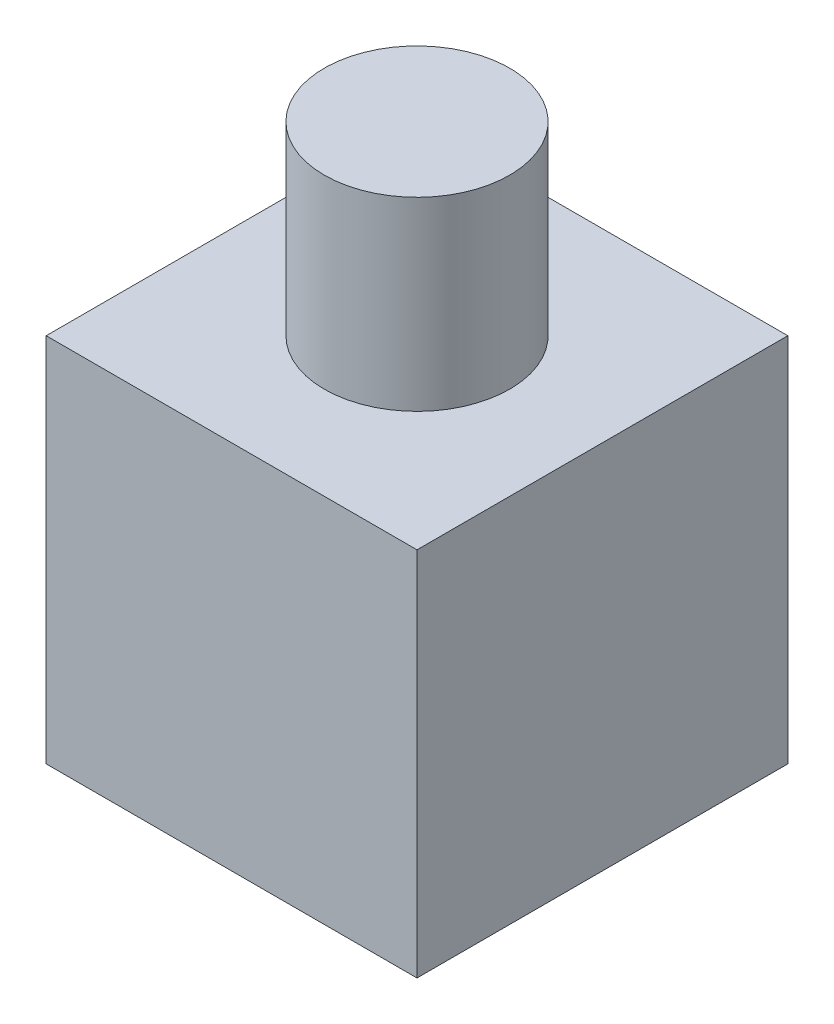
ISO-10303-21;
HEADER;
FILE_DESCRIPTION(('STEP AP214'),'2;1');
FILE_NAME('part.step','',(''),(''),'','','');
FILE_SCHEMA(('AUTOMOTIVE_DESIGN { 1 0 10303 214 1 1 1 1 }'));
ENDSEC;
DATA;
#1=APPLICATION_CONTEXT('core data for automotive mechanical design processes');
#2=APPLICATION_PROTOCOL_DEFINITION('international standard','automotive_design',2000,#1);
#3=PRODUCT_CONTEXT('',#1,'mechanical');
#4=PRODUCT('Part','Part','',(#3));
#5=PRODUCT_RELATED_PRODUCT_CATEGORY('part','',(#4));
#6=PRODUCT_DEFINITION_FORMATION('','',#4);
#7=PRODUCT_DEFINITION_CONTEXT('part definition',#1,'design');
#8=PRODUCT_DEFINITION('design','',#6,#7);
#9=PRODUCT_DEFINITION_SHAPE('','',#8);
#10=(LENGTH_UNIT() NAMED_UNIT(*) SI_UNIT(.MILLI.,.METRE.));
#11=(NAMED_UNIT(*) PLANE_ANGLE_UNIT() SI_UNIT($,.RADIAN.));
#12=(NAMED_UNIT(*) SI_UNIT($,.STERADIAN.) SOLID_ANGLE_UNIT());
#13=UNCERTAINTY_MEASURE_WITH_UNIT(LENGTH_MEASURE(1.E-05),#10,'distance_accuracy_value','');
#14=(GEOMETRIC_REPRESENTATION_CONTEXT(3) GLOBAL_UNCERTAINTY_ASSIGNED_CONTEXT((#13)) GLOBAL_UNIT_ASSIGNED_CONTEXT((#10,
#11,#12)) REPRESENTATION_CONTEXT('',''));
#15=CARTESIAN_POINT('',(0.,0.,0.));
#16=DIRECTION('',(0.,0.,1.));
#17=DIRECTION('',(1.,0.,0.));
#18=AXIS2_PLACEMENT_3D('',#15,#16,#17);
#19=CARTESIAN_POINT('',(0.,254.,0.));
#20=DIRECTION('',(1.,0.,0.));
#21=DIRECTION('',(0.,0.,-1.));
#22=AXIS2_PLACEMENT_3D('',#19,#20,#21);
#23=PLANE('',#22);
#24=DIRECTION('',(0.,0.,1.));
#25=VECTOR('',#24,1.);
#26=CARTESIAN_POINT('',(0.,0.,0.));
#27=LINE('',#26,#25);
#28=CARTESIAN_POINT('',(0.,0.,-254.));
#29=VERTEX_POINT('',#28);
#30=CARTESIAN_POINT('',(0.,0.,0.));
#31=VERTEX_POINT('',#30);
#32=EDGE_CURVE('E110',#29,#31,#27,.T.);
#33=ORIENTED_EDGE('',*,*,#32,.T.);
#34=DIRECTION('',(0.,-1.,0.));
#35=VECTOR('',#34,1.);
#36=CARTESIAN_POINT('',(0.,254.,0.));
#37=LINE('',#36,#35);
#38=CARTESIAN_POINT('',(0.,254.,0.));
#39=VERTEX_POINT('',#38);
#40=EDGE_CURVE('E42',#39,#31,#37,.T.);
#41=ORIENTED_EDGE('',*,*,#40,.F.);
#42=DIRECTION('',(0.,0.,1.));
#43=VECTOR('',#42,1.);
#44=CARTESIAN_POINT('',(0.,254.,0.));
#45=LINE('',#44,#43);
#46=CARTESIAN_POINT('',(0.,254.,-254.));
#47=VERTEX_POINT('',#46);
#48=EDGE_CURVE('E93',#47,#39,#45,.T.);
#49=ORIENTED_EDGE('',*,*,#48,.F.);
#50=DIRECTION('',(0.,-1.,0.));
#51=VECTOR('',#50,1.);
#52=CARTESIAN_POINT('',(0.,254.,-254.));
#53=LINE('',#52,#51);
#54=EDGE_CURVE('E106',#47,#29,#53,.T.);
#55=ORIENTED_EDGE('',*,*,#54,.T.);
#56=EDGE_LOOP('',(#33,#41,#49,#55));
#57=FACE_BOUND('',#56,.T.);
#58=ADVANCED_FACE('F39',(#57),#23,.F.);
#59=CARTESIAN_POINT('',(0.,254.,0.));
#60=DIRECTION('',(0.,0.,-1.));
#61=DIRECTION('',(-1.,0.,0.));
#62=AXIS2_PLACEMENT_3D('',#59,#60,#61);
#63=PLANE('',#62);
#64=DIRECTION('',(1.,0.,0.));
#65=VECTOR('',#64,1.);
#66=CARTESIAN_POINT('',(0.,0.,0.));
#67=LINE('',#66,#65);
#68=CARTESIAN_POINT('',(254.,0.,0.));
#69=VERTEX_POINT('',#68);
#70=EDGE_CURVE('E99',#31,#69,#67,.T.);
#71=ORIENTED_EDGE('',*,*,#70,.T.);
#72=DIRECTION('',(0.,-1.,0.));
#73=VECTOR('',#72,1.);
#74=CARTESIAN_POINT('',(254.,254.,0.));
#75=LINE('',#74,#73);
#76=CARTESIAN_POINT('',(254.,254.,0.));
#77=VERTEX_POINT('',#76);
#78=EDGE_CURVE('E97',#77,#69,#75,.T.);
#79=ORIENTED_EDGE('',*,*,#78,.F.);
#80=DIRECTION('',(1.,0.,0.));
#81=VECTOR('',#80,1.);
#82=CARTESIAN_POINT('',(0.,254.,0.));
#83=LINE('',#82,#81);
#84=EDGE_CURVE('E88',#39,#77,#83,.T.);
#85=ORIENTED_EDGE('',*,*,#84,.F.);
#86=ORIENTED_EDGE('',*,*,#40,.T.);
#87=EDGE_LOOP('',(#71,#79,#85,#86));
#88=FACE_BOUND('',#87,.T.);
#89=ADVANCED_FACE('F98',(#88),#63,.F.);
#90=CARTESIAN_POINT('',(254.,254.,0.));
#91=DIRECTION('',(-1.,0.,0.));
#92=DIRECTION('',(0.,0.,1.));
#93=AXIS2_PLACEMENT_3D('',#90,#91,#92);
#94=PLANE('',#93);
#95=DIRECTION('',(0.,0.,-1.));
#96=VECTOR('',#95,1.);
#97=CARTESIAN_POINT('',(254.,0.,0.));
#98=LINE('',#97,#96);
#99=CARTESIAN_POINT('',(254.,0.,-254.));
#100=VERTEX_POINT('',#99);
#101=EDGE_CURVE('E74',#69,#100,#98,.T.);
#102=ORIENTED_EDGE('',*,*,#101,.T.);
#103=DIRECTION('',(0.,-1.,0.));
#104=VECTOR('',#103,1.);
#105=CARTESIAN_POINT('',(254.,254.,-254.));
#106=LINE('',#105,#104);
#107=CARTESIAN_POINT('',(254.,254.,-254.));
#108=VERTEX_POINT('',#107);
#109=EDGE_CURVE('E101',#108,#100,#106,.T.);
#110=ORIENTED_EDGE('',*,*,#109,.F.);
#111=DIRECTION('',(0.,0.,-1.));
#112=VECTOR('',#111,1.);
#113=CARTESIAN_POINT('',(254.,254.,0.));
#114=LINE('',#113,#112);
#115=EDGE_CURVE('E91',#77,#108,#114,.T.);
#116=ORIENTED_EDGE('',*,*,#115,.F.);
#117=ORIENTED_EDGE('',*,*,#78,.T.);
#118=EDGE_LOOP('',(#102,#110,#116,#117));
#119=FACE_BOUND('',#118,.T.);
#120=ADVANCED_FACE('F102',(#119),#94,.F.);
#121=CARTESIAN_POINT('',(0.,254.,-254.));
#122=DIRECTION('',(0.,0.,1.));
#123=DIRECTION('',(1.,0.,0.));
#124=AXIS2_PLACEMENT_3D('',#121,#122,#123);
#125=PLANE('',#124);
#126=DIRECTION('',(-1.,0.,0.));
#127=VECTOR('',#126,1.);
#128=CARTESIAN_POINT('',(0.,0.,-254.));
#129=LINE('',#128,#127);
#130=EDGE_CURVE('E80',#100,#29,#129,.T.);
#131=ORIENTED_EDGE('',*,*,#130,.T.);
#132=ORIENTED_EDGE('',*,*,#54,.F.);
#133=DIRECTION('',(-1.,0.,0.));
#134=VECTOR('',#133,1.);
#135=CARTESIAN_POINT('',(0.,254.,-254.));
#136=LINE('',#135,#134);
#137=EDGE_CURVE('E57',#108,#47,#136,.T.);
#138=ORIENTED_EDGE('',*,*,#137,.F.);
#139=ORIENTED_EDGE('',*,*,#109,.T.);
#140=EDGE_LOOP('',(#131,#132,#138,#139));
#141=FACE_BOUND('',#140,.T.);
#142=ADVANCED_FACE('F124',(#141),#125,.F.);
#143=CARTESIAN_POINT('',(0.,254.,0.));
#144=DIRECTION('',(0.,-1.,0.));
#145=DIRECTION('',(0.,0.,-1.));
#146=AXIS2_PLACEMENT_3D('',#143,#144,#145);
#147=PLANE('',#146);
#148=CARTESIAN_POINT('',(127.,254.,-127.));
#149=DIRECTION('',(0.,1.,0.));
#150=DIRECTION('',(0.,0.,1.));
#151=AXIS2_PLACEMENT_3D('',#148,#149,#150);
#152=CIRCLE('',#151,63.5);
#153=CARTESIAN_POINT('',(127.,254.,-63.5));
#154=VERTEX_POINT('',#153);
#155=EDGE_CURVE('E11',#154,#154,#152,.T.);
#156=ORIENTED_EDGE('',*,*,#155,.F.);
#157=EDGE_LOOP('',(#156));
#158=FACE_BOUND('',#157,.T.);
#159=ORIENTED_EDGE('',*,*,#48,.T.);
#160=ORIENTED_EDGE('',*,*,#84,.T.);
#161=ORIENTED_EDGE('',*,*,#115,.T.);
#162=ORIENTED_EDGE('',*,*,#137,.T.);
#163=EDGE_LOOP('',(#159,#160,#161,#162));
#164=FACE_BOUND('',#163,.T.);
#165=ADVANCED_FACE('F89',(#158,#164),#147,.F.);
#166=CARTESIAN_POINT('',(0.,0.,0.));
#167=DIRECTION('',(0.,-1.,0.));
#168=DIRECTION('',(0.,0.,-1.));
#169=AXIS2_PLACEMENT_3D('',#166,#167,#168);
#170=PLANE('',#169);
#171=ORIENTED_EDGE('',*,*,#32,.F.);
#172=ORIENTED_EDGE('',*,*,#130,.F.);
#173=ORIENTED_EDGE('',*,*,#101,.F.);
#174=ORIENTED_EDGE('',*,*,#70,.F.);
#175=EDGE_LOOP('',(#171,#172,#173,#174));
#176=FACE_BOUND('',#175,.T.);
#177=ADVANCED_FACE('F127',(#176),#170,.T.);
#178=CARTESIAN_POINT('',(127.,381.,-127.));
#179=DIRECTION('',(0.,-1.,0.));
#180=DIRECTION('',(0.,0.,-1.));
#181=AXIS2_PLACEMENT_3D('',#178,#179,#180);
#182=CYLINDRICAL_SURFACE('',#181,63.5);
#183=CARTESIAN_POINT('',(127.,381.,-127.));
#184=DIRECTION('',(0.,1.,0.));
#185=DIRECTION('',(0.,0.,1.));
#186=AXIS2_PLACEMENT_3D('',#183,#184,#185);
#187=CIRCLE('',#186,63.5);
#188=CARTESIAN_POINT('',(127.,381.,-63.5));
#189=VERTEX_POINT('',#188);
#190=EDGE_CURVE('E114',#189,#189,#187,.T.);
#191=ORIENTED_EDGE('',*,*,#190,.F.);
#192=EDGE_LOOP('',(#191));
#193=FACE_BOUND('',#192,.T.);
#194=ORIENTED_EDGE('',*,*,#155,.T.);
#195=EDGE_LOOP('',(#194));
#196=FACE_BOUND('',#195,.T.);
#197=ADVANCED_FACE('F137',(#193,#196),#182,.T.);
#198=CARTESIAN_POINT('',(127.,381.,-127.));
#199=DIRECTION('',(0.,1.,0.));
#200=DIRECTION('',(0.,0.,1.));
#201=AXIS2_PLACEMENT_3D('',#198,#199,#200);
#202=PLANE('',#201);
#203=ORIENTED_EDGE('',*,*,#190,.T.);
#204=EDGE_LOOP('',(#203));
#205=FACE_BOUND('',#204,.T.);
#206=ADVANCED_FACE('F135',(#205),#202,.T.);
#207=CLOSED_SHELL('',(#58,#89,#120,#142,#165,#177,#197,#206));
#208=MANIFOLD_SOLID_BREP('B2',#207);
#209=ADVANCED_BREP_SHAPE_REPRESENTATION('',(#18,#208),#14);
#210=SHAPE_DEFINITION_REPRESENTATION(#9,#209);
ENDSEC;
END-ISO-10303-21;
